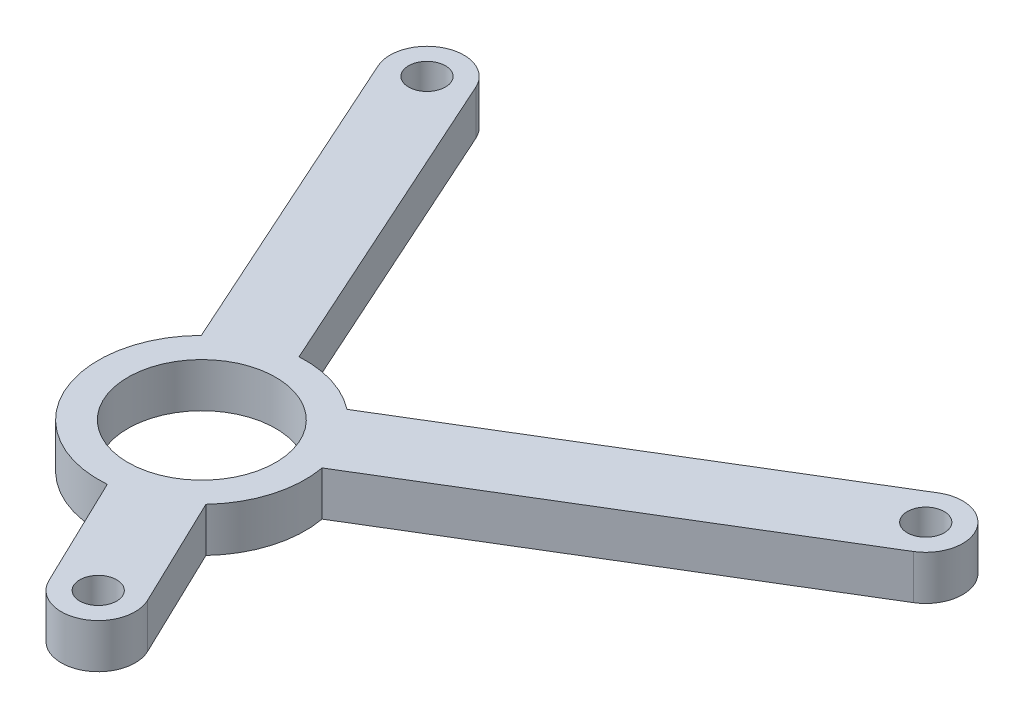
ISO-10303-21;
HEADER;
FILE_DESCRIPTION(('STEP AP214'),'2;1');
FILE_NAME('part.step','',(''),(''),'','','');
FILE_SCHEMA(('AUTOMOTIVE_DESIGN { 1 0 10303 214 1 1 1 1 }'));
ENDSEC;
DATA;
#1=APPLICATION_CONTEXT('core data for automotive mechanical design processes');
#2=APPLICATION_PROTOCOL_DEFINITION('international standard','automotive_design',2000,#1);
#3=PRODUCT_CONTEXT('',#1,'mechanical');
#4=PRODUCT('Part','Part','',(#3));
#5=PRODUCT_RELATED_PRODUCT_CATEGORY('part','',(#4));
#6=PRODUCT_DEFINITION_FORMATION('','',#4);
#7=PRODUCT_DEFINITION_CONTEXT('part definition',#1,'design');
#8=PRODUCT_DEFINITION('design','',#6,#7);
#9=PRODUCT_DEFINITION_SHAPE('','',#8);
#10=(LENGTH_UNIT() NAMED_UNIT(*) SI_UNIT(.MILLI.,.METRE.));
#11=(NAMED_UNIT(*) PLANE_ANGLE_UNIT() SI_UNIT($,.RADIAN.));
#12=(NAMED_UNIT(*) SI_UNIT($,.STERADIAN.) SOLID_ANGLE_UNIT());
#13=UNCERTAINTY_MEASURE_WITH_UNIT(LENGTH_MEASURE(1.E-05),#10,'distance_accuracy_value','');
#14=(GEOMETRIC_REPRESENTATION_CONTEXT(3) GLOBAL_UNCERTAINTY_ASSIGNED_CONTEXT((#13)) GLOBAL_UNIT_ASSIGNED_CONTEXT((#10,
#11,#12)) REPRESENTATION_CONTEXT('',''));
#15=CARTESIAN_POINT('',(0.,0.,0.));
#16=DIRECTION('',(0.,0.,1.));
#17=DIRECTION('',(1.,0.,0.));
#18=AXIS2_PLACEMENT_3D('',#15,#16,#17);
#19=CARTESIAN_POINT('',(0.,3.,0.));
#20=DIRECTION('',(0.,1.,0.));
#21=DIRECTION('',(0.,0.,1.));
#22=AXIS2_PLACEMENT_3D('',#19,#20,#21);
#23=PLANE('',#22);
#24=CARTESIAN_POINT('',(-6.49000000000011,3.,11.5));
#25=DIRECTION('',(0.,1.,0.));
#26=DIRECTION('',(0.,0.,1.));
#27=AXIS2_PLACEMENT_3D('',#24,#25,#26);
#28=CIRCLE('',#27,5.00000000000009);
#29=CARTESIAN_POINT('',(-6.49000000000011,3.,16.5));
#30=VERTEX_POINT('',#29);
#31=EDGE_CURVE('E392',#30,#30,#28,.T.);
#32=ORIENTED_EDGE('',*,*,#31,.F.);
#33=EDGE_LOOP('',(#32));
#34=FACE_BOUND('',#33,.T.);
#35=CARTESIAN_POINT('',(24.,3.,-7.));
#36=DIRECTION('',(0.,1.,0.));
#37=DIRECTION('',(0.,0.,1.));
#38=AXIS2_PLACEMENT_3D('',#35,#36,#37);
#39=CIRCLE('',#38,1.25);
#40=CARTESIAN_POINT('',(24.,3.,-5.75));
#41=VERTEX_POINT('',#40);
#42=EDGE_CURVE('E487',#41,#41,#39,.T.);
#43=ORIENTED_EDGE('',*,*,#42,.F.);
#44=EDGE_LOOP('',(#43));
#45=FACE_BOUND('',#44,.T.);
#46=CARTESIAN_POINT('',(-19.,3.,-16.2480768092719));
#47=DIRECTION('',(0.,1.,0.));
#48=DIRECTION('',(0.,0.,1.));
#49=AXIS2_PLACEMENT_3D('',#46,#47,#48);
#50=CIRCLE('',#49,1.25);
#51=CARTESIAN_POINT('',(-19.,3.,-14.9980768092719));
#52=VERTEX_POINT('',#51);
#53=EDGE_CURVE('E479',#52,#52,#50,.T.);
#54=ORIENTED_EDGE('',*,*,#53,.F.);
#55=EDGE_LOOP('',(#54));
#56=FACE_BOUND('',#55,.T.);
#57=CARTESIAN_POINT('',(0.,3.,25.));
#58=DIRECTION('',(0.,1.,0.));
#59=DIRECTION('',(0.,0.,1.));
#60=AXIS2_PLACEMENT_3D('',#57,#58,#59);
#61=CIRCLE('',#60,1.25);
#62=CARTESIAN_POINT('',(0.,3.,26.25));
#63=VERTEX_POINT('',#62);
#64=EDGE_CURVE('E292',#63,#63,#61,.T.);
#65=ORIENTED_EDGE('',*,*,#64,.F.);
#66=EDGE_LOOP('',(#65));
#67=FACE_BOUND('',#66,.T.);
#68=DIRECTION('',(-0.433273578462035,0.,-0.901262451346278));
#69=VECTOR('',#68,1.);
#70=CARTESIAN_POINT('',(-12.0154863140724,3.,5.77633379098752));
#71=LINE('',#70,#69);
#72=CARTESIAN_POINT('',(-2.2531561283657,3.,26.0831839461551));
#73=VERTEX_POINT('',#72);
#74=CARTESIAN_POINT('',(-5.91026251323244,3.,18.4759518666944));
#75=VERTEX_POINT('',#74);
#76=EDGE_CURVE('E414',#73,#75,#71,.T.);
#77=ORIENTED_EDGE('',*,*,#76,.F.);
#78=CARTESIAN_POINT('',(0.,3.,25.));
#79=DIRECTION('',(0.,1.,0.));
#80=DIRECTION('',(0.,0.,1.));
#81=AXIS2_PLACEMENT_3D('',#78,#79,#80);
#82=CIRCLE('',#81,2.5);
#83=CARTESIAN_POINT('',(2.2531561283657,3.,23.9168160538449));
#84=VERTEX_POINT('',#83);
#85=EDGE_CURVE('E417',#73,#84,#82,.T.);
#86=ORIENTED_EDGE('',*,*,#85,.T.);
#87=DIRECTION('',(-0.433273578462035,0.,-0.901262451346278));
#88=VECTOR('',#87,1.);
#89=CARTESIAN_POINT('',(-7.50917405734101,3.,3.60996589867735));
#90=LINE('',#89,#88);
#91=CARTESIAN_POINT('',(-1.40395025650104,3.,16.3095839743842));
#92=VERTEX_POINT('',#91);
#93=EDGE_CURVE('E439',#84,#92,#90,.T.);
#94=ORIENTED_EDGE('',*,*,#93,.T.);
#95=CARTESIAN_POINT('',(-6.49000000000011,3.,11.5));
#96=DIRECTION('',(0.,1.,0.));
#97=DIRECTION('',(0.,0.,1.));
#98=AXIS2_PLACEMENT_3D('',#95,#96,#97);
#99=CIRCLE('',#98,7.00000000000009);
#100=CARTESIAN_POINT('',(0.396698534826501,3.,10.2456542380914));
#101=VERTEX_POINT('',#100);
#102=EDGE_CURVE('E435',#92,#101,#99,.T.);
#103=ORIENTED_EDGE('',*,*,#102,.T.);
#104=DIRECTION('',(-0.854934082594623,0.,0.51873665227945));
#105=VECTOR('',#104,1.);
#106=CARTESIAN_POINT('',(4.65054726925964,3.,7.66460466160688));
#107=LINE('',#106,#105);
#108=CARTESIAN_POINT('',(25.2968416306986,3.,-4.86266479351345));
#109=VERTEX_POINT('',#108);
#110=EDGE_CURVE('E444',#109,#101,#107,.T.);
#111=ORIENTED_EDGE('',*,*,#110,.F.);
#112=CARTESIAN_POINT('',(24.,3.,-7.));
#113=DIRECTION('',(0.,1.,0.));
#114=DIRECTION('',(0.,0.,1.));
#115=AXIS2_PLACEMENT_3D('',#112,#113,#114);
#116=CIRCLE('',#115,2.49999999999999);
#117=CARTESIAN_POINT('',(22.7031583693014,3.,-9.13733520648656));
#118=VERTEX_POINT('',#117);
#119=EDGE_CURVE('E462',#109,#118,#116,.T.);
#120=ORIENTED_EDGE('',*,*,#119,.T.);
#121=DIRECTION('',(-0.854934082594623,0.,0.51873665227945));
#122=VECTOR('',#121,1.);
#123=CARTESIAN_POINT('',(2.0568640078624,3.,3.38993424863378));
#124=LINE('',#123,#122);
#125=CARTESIAN_POINT('',(-2.19698472657074,3.,5.97098382511828));
#126=VERTEX_POINT('',#125);
#127=EDGE_CURVE('E473',#118,#126,#124,.T.);
#128=ORIENTED_EDGE('',*,*,#127,.T.);
#129=CARTESIAN_POINT('',(-6.49000000000011,3.,11.5));
#130=DIRECTION('',(0.,1.,0.));
#131=DIRECTION('',(0.,0.,1.));
#132=AXIS2_PLACEMENT_3D('',#129,#130,#131);
#133=CIRCLE('',#132,7.00000000000009);
#134=CARTESIAN_POINT('',(-6.89819547233546,3.,4.51191181678674));
#135=VERTEX_POINT('',#134);
#136=EDGE_CURVE('E471',#126,#135,#133,.T.);
#137=ORIENTED_EDGE('',*,*,#136,.T.);
#138=DIRECTION('',(-0.411002952606421,0.,-0.911634012610765));
#139=VECTOR('',#138,1.);
#140=CARTESIAN_POINT('',(-7.42347104202468,3.,3.34681294758043));
#141=LINE('',#140,#139);
#142=CARTESIAN_POINT('',(-16.720914968473,3.,-17.275584190788));
#143=VERTEX_POINT('',#142);
#144=EDGE_CURVE('E390',#135,#143,#141,.T.);
#145=ORIENTED_EDGE('',*,*,#144,.T.);
#146=CARTESIAN_POINT('',(-19.,3.,-16.2480768092719));
#147=DIRECTION('',(0.,1.,0.));
#148=DIRECTION('',(0.,0.,1.));
#149=AXIS2_PLACEMENT_3D('',#146,#147,#148);
#150=CIRCLE('',#149,2.5);
#151=CARTESIAN_POINT('',(-21.279085031527,3.,-15.2205694277558));
#152=VERTEX_POINT('',#151);
#153=EDGE_CURVE('E383',#143,#152,#150,.T.);
#154=ORIENTED_EDGE('',*,*,#153,.T.);
#155=DIRECTION('',(0.411002952606429,0.,0.911634012610761));
#156=VECTOR('',#155,1.);
#157=CARTESIAN_POINT('',(-11.9816411050785,3.,5.40182771061266));
#158=LINE('',#157,#156);
#159=CARTESIAN_POINT('',(-11.4563655353894,3.,6.56692657981878));
#160=VERTEX_POINT('',#159);
#161=EDGE_CURVE('E388',#152,#160,#158,.T.);
#162=ORIENTED_EDGE('',*,*,#161,.T.);
#163=CARTESIAN_POINT('',(-6.49000000000011,3.,11.5));
#164=DIRECTION('',(0.,1.,0.));
#165=DIRECTION('',(0.,0.,1.));
#166=AXIS2_PLACEMENT_3D('',#163,#164,#165);
#167=CIRCLE('',#166,7.00000000000009);
#168=EDGE_CURVE('E401',#160,#75,#167,.T.);
#169=ORIENTED_EDGE('',*,*,#168,.T.);
#170=EDGE_LOOP('',(#77,#86,#94,#103,#111,#120,#128,#137,#145,#154,#162,#169));
#171=FACE_BOUND('',#170,.T.);
#172=ADVANCED_FACE('F288',(#34,#45,#56,#67,#171),#23,.T.);
#173=CARTESIAN_POINT('',(0.,0.,0.));
#174=DIRECTION('',(0.,1.,0.));
#175=DIRECTION('',(0.,0.,1.));
#176=AXIS2_PLACEMENT_3D('',#173,#174,#175);
#177=PLANE('',#176);
#178=CARTESIAN_POINT('',(-6.49000000000011,0.,11.5));
#179=DIRECTION('',(0.,1.,0.));
#180=DIRECTION('',(0.,0.,1.));
#181=AXIS2_PLACEMENT_3D('',#178,#179,#180);
#182=CIRCLE('',#181,5.00000000000009);
#183=CARTESIAN_POINT('',(-6.49000000000011,0.,16.5));
#184=VERTEX_POINT('',#183);
#185=EDGE_CURVE('E447',#184,#184,#182,.T.);
#186=ORIENTED_EDGE('',*,*,#185,.T.);
#187=EDGE_LOOP('',(#186));
#188=FACE_BOUND('',#187,.T.);
#189=CARTESIAN_POINT('',(0.,0.,25.));
#190=DIRECTION('',(0.,1.,0.));
#191=DIRECTION('',(0.,0.,1.));
#192=AXIS2_PLACEMENT_3D('',#189,#190,#191);
#193=CIRCLE('',#192,1.25);
#194=CARTESIAN_POINT('',(0.,0.,26.25));
#195=VERTEX_POINT('',#194);
#196=EDGE_CURVE('E12',#195,#195,#193,.T.);
#197=ORIENTED_EDGE('',*,*,#196,.T.);
#198=EDGE_LOOP('',(#197));
#199=FACE_BOUND('',#198,.T.);
#200=CARTESIAN_POINT('',(-19.,0.,-16.2480768092719));
#201=DIRECTION('',(0.,1.,0.));
#202=DIRECTION('',(0.,0.,1.));
#203=AXIS2_PLACEMENT_3D('',#200,#201,#202);
#204=CIRCLE('',#203,1.25);
#205=CARTESIAN_POINT('',(-19.,0.,-14.9980768092719));
#206=VERTEX_POINT('',#205);
#207=EDGE_CURVE('E490',#206,#206,#204,.T.);
#208=ORIENTED_EDGE('',*,*,#207,.T.);
#209=EDGE_LOOP('',(#208));
#210=FACE_BOUND('',#209,.T.);
#211=CARTESIAN_POINT('',(24.,0.,-7.));
#212=DIRECTION('',(0.,1.,0.));
#213=DIRECTION('',(0.,0.,1.));
#214=AXIS2_PLACEMENT_3D('',#211,#212,#213);
#215=CIRCLE('',#214,1.25);
#216=CARTESIAN_POINT('',(24.,0.,-5.75));
#217=VERTEX_POINT('',#216);
#218=EDGE_CURVE('E484',#217,#217,#215,.T.);
#219=ORIENTED_EDGE('',*,*,#218,.T.);
#220=EDGE_LOOP('',(#219));
#221=FACE_BOUND('',#220,.T.);
#222=CARTESIAN_POINT('',(0.,0.,25.));
#223=DIRECTION('',(0.,1.,0.));
#224=DIRECTION('',(0.,0.,1.));
#225=AXIS2_PLACEMENT_3D('',#222,#223,#224);
#226=CIRCLE('',#225,2.5);
#227=CARTESIAN_POINT('',(-2.2531561283657,0.,26.0831839461551));
#228=VERTEX_POINT('',#227);
#229=CARTESIAN_POINT('',(2.2531561283657,0.,23.9168160538449));
#230=VERTEX_POINT('',#229);
#231=EDGE_CURVE('E429',#228,#230,#226,.T.);
#232=ORIENTED_EDGE('',*,*,#231,.F.);
#233=DIRECTION('',(-0.433273578462035,0.,-0.901262451346278));
#234=VECTOR('',#233,1.);
#235=CARTESIAN_POINT('',(-12.0154863140724,0.,5.77633379098752));
#236=LINE('',#235,#234);
#237=CARTESIAN_POINT('',(-5.91026251323244,0.,18.4759518666944));
#238=VERTEX_POINT('',#237);
#239=EDGE_CURVE('E423',#228,#238,#236,.T.);
#240=ORIENTED_EDGE('',*,*,#239,.T.);
#241=CARTESIAN_POINT('',(-6.49000000000011,0.,11.5));
#242=DIRECTION('',(0.,1.,0.));
#243=DIRECTION('',(0.,0.,1.));
#244=AXIS2_PLACEMENT_3D('',#241,#242,#243);
#245=CIRCLE('',#244,7.00000000000009);
#246=CARTESIAN_POINT('',(-11.4563655353894,0.,6.56692657981878));
#247=VERTEX_POINT('',#246);
#248=EDGE_CURVE('E418',#247,#238,#245,.T.);
#249=ORIENTED_EDGE('',*,*,#248,.F.);
#250=DIRECTION('',(0.411002952606429,0.,0.911634012610761));
#251=VECTOR('',#250,1.);
#252=CARTESIAN_POINT('',(-11.9816411050785,0.,5.40182771061266));
#253=LINE('',#252,#251);
#254=CARTESIAN_POINT('',(-21.279085031527,0.,-15.2205694277558));
#255=VERTEX_POINT('',#254);
#256=EDGE_CURVE('E419',#255,#247,#253,.T.);
#257=ORIENTED_EDGE('',*,*,#256,.F.);
#258=CARTESIAN_POINT('',(-19.,0.,-16.2480768092719));
#259=DIRECTION('',(0.,1.,0.));
#260=DIRECTION('',(0.,0.,1.));
#261=AXIS2_PLACEMENT_3D('',#258,#259,#260);
#262=CIRCLE('',#261,2.5);
#263=CARTESIAN_POINT('',(-16.720914968473,0.,-17.275584190788));
#264=VERTEX_POINT('',#263);
#265=EDGE_CURVE('E398',#264,#255,#262,.T.);
#266=ORIENTED_EDGE('',*,*,#265,.F.);
#267=DIRECTION('',(-0.411002952606421,0.,-0.911634012610765));
#268=VECTOR('',#267,1.);
#269=CARTESIAN_POINT('',(-7.42347104202468,0.,3.34681294758043));
#270=LINE('',#269,#268);
#271=CARTESIAN_POINT('',(-6.89819547233546,0.,4.51191181678674));
#272=VERTEX_POINT('',#271);
#273=EDGE_CURVE('E332',#272,#264,#270,.T.);
#274=ORIENTED_EDGE('',*,*,#273,.F.);
#275=CARTESIAN_POINT('',(-6.49000000000011,0.,11.5));
#276=DIRECTION('',(0.,1.,0.));
#277=DIRECTION('',(0.,0.,1.));
#278=AXIS2_PLACEMENT_3D('',#275,#276,#277);
#279=CIRCLE('',#278,7.00000000000009);
#280=CARTESIAN_POINT('',(-2.19698472657074,0.,5.97098382511828));
#281=VERTEX_POINT('',#280);
#282=EDGE_CURVE('E464',#281,#272,#279,.T.);
#283=ORIENTED_EDGE('',*,*,#282,.F.);
#284=DIRECTION('',(-0.854934082594623,0.,0.51873665227945));
#285=VECTOR('',#284,1.);
#286=CARTESIAN_POINT('',(2.0568640078624,0.,3.38993424863378));
#287=LINE('',#286,#285);
#288=CARTESIAN_POINT('',(22.7031583693014,0.,-9.13733520648656));
#289=VERTEX_POINT('',#288);
#290=EDGE_CURVE('E466',#289,#281,#287,.T.);
#291=ORIENTED_EDGE('',*,*,#290,.F.);
#292=CARTESIAN_POINT('',(24.,0.,-7.));
#293=DIRECTION('',(0.,1.,0.));
#294=DIRECTION('',(0.,0.,1.));
#295=AXIS2_PLACEMENT_3D('',#292,#293,#294);
#296=CIRCLE('',#295,2.49999999999999);
#297=CARTESIAN_POINT('',(25.2968416306986,0.,-4.86266479351345));
#298=VERTEX_POINT('',#297);
#299=EDGE_CURVE('E312',#298,#289,#296,.T.);
#300=ORIENTED_EDGE('',*,*,#299,.F.);
#301=DIRECTION('',(-0.854934082594623,0.,0.51873665227945));
#302=VECTOR('',#301,1.);
#303=CARTESIAN_POINT('',(4.65054726925964,0.,7.66460466160688));
#304=LINE('',#303,#302);
#305=CARTESIAN_POINT('',(0.396698534826501,0.,10.2456542380914));
#306=VERTEX_POINT('',#305);
#307=EDGE_CURVE('E432',#298,#306,#304,.T.);
#308=ORIENTED_EDGE('',*,*,#307,.T.);
#309=CARTESIAN_POINT('',(-6.49000000000011,0.,11.5));
#310=DIRECTION('',(0.,1.,0.));
#311=DIRECTION('',(0.,0.,1.));
#312=AXIS2_PLACEMENT_3D('',#309,#310,#311);
#313=CIRCLE('',#312,7.00000000000009);
#314=CARTESIAN_POINT('',(-1.40395025650104,0.,16.3095839743842));
#315=VERTEX_POINT('',#314);
#316=EDGE_CURVE('E448',#315,#306,#313,.T.);
#317=ORIENTED_EDGE('',*,*,#316,.F.);
#318=DIRECTION('',(-0.433273578462035,0.,-0.901262451346278));
#319=VECTOR('',#318,1.);
#320=CARTESIAN_POINT('',(-7.50917405734101,0.,3.60996589867735));
#321=LINE('',#320,#319);
#322=EDGE_CURVE('E451',#230,#315,#321,.T.);
#323=ORIENTED_EDGE('',*,*,#322,.F.);
#324=EDGE_LOOP('',(#232,#240,#249,#257,#266,#274,#283,#291,#300,#308,#317,#323));
#325=FACE_BOUND('',#324,.T.);
#326=ADVANCED_FACE('F290',(#188,#199,#210,#221,#325),#177,.F.);
#327=CARTESIAN_POINT('',(0.,0.,25.));
#328=DIRECTION('',(0.,1.,0.));
#329=DIRECTION('',(0.,0.,1.));
#330=AXIS2_PLACEMENT_3D('',#327,#328,#329);
#331=CYLINDRICAL_SURFACE('',#330,1.25);
#332=ORIENTED_EDGE('',*,*,#196,.F.);
#333=EDGE_LOOP('',(#332));
#334=FACE_BOUND('',#333,.T.);
#335=ORIENTED_EDGE('',*,*,#64,.T.);
#336=EDGE_LOOP('',(#335));
#337=FACE_BOUND('',#336,.T.);
#338=ADVANCED_FACE('F504',(#334,#337),#331,.F.);
#339=CARTESIAN_POINT('',(-19.,0.,-16.2480768092719));
#340=DIRECTION('',(0.,1.,0.));
#341=DIRECTION('',(0.,0.,1.));
#342=AXIS2_PLACEMENT_3D('',#339,#340,#341);
#343=CYLINDRICAL_SURFACE('',#342,1.25);
#344=ORIENTED_EDGE('',*,*,#207,.F.);
#345=EDGE_LOOP('',(#344));
#346=FACE_BOUND('',#345,.T.);
#347=ORIENTED_EDGE('',*,*,#53,.T.);
#348=EDGE_LOOP('',(#347));
#349=FACE_BOUND('',#348,.T.);
#350=ADVANCED_FACE('F496',(#346,#349),#343,.F.);
#351=CARTESIAN_POINT('',(24.,0.,-7.));
#352=DIRECTION('',(0.,1.,0.));
#353=DIRECTION('',(0.,0.,1.));
#354=AXIS2_PLACEMENT_3D('',#351,#352,#353);
#355=CYLINDRICAL_SURFACE('',#354,1.25);
#356=ORIENTED_EDGE('',*,*,#218,.F.);
#357=EDGE_LOOP('',(#356));
#358=FACE_BOUND('',#357,.T.);
#359=ORIENTED_EDGE('',*,*,#42,.T.);
#360=EDGE_LOOP('',(#359));
#361=FACE_BOUND('',#360,.T.);
#362=ADVANCED_FACE('F512',(#358,#361),#355,.F.);
#363=CARTESIAN_POINT('',(-19.,0.,-16.2480768092719));
#364=DIRECTION('',(0.,1.,0.));
#365=DIRECTION('',(0.,0.,1.));
#366=AXIS2_PLACEMENT_3D('',#363,#364,#365);
#367=CYLINDRICAL_SURFACE('',#366,2.5);
#368=ORIENTED_EDGE('',*,*,#153,.F.);
#369=DIRECTION('',(0.,1.,0.));
#370=VECTOR('',#369,1.);
#371=CARTESIAN_POINT('',(-16.720914968473,0.,-17.275584190788));
#372=LINE('',#371,#370);
#373=EDGE_CURVE('E468',#264,#143,#372,.T.);
#374=ORIENTED_EDGE('',*,*,#373,.F.);
#375=ORIENTED_EDGE('',*,*,#265,.T.);
#376=DIRECTION('',(0.,1.,0.));
#377=VECTOR('',#376,1.);
#378=CARTESIAN_POINT('',(-21.279085031527,0.,-15.2205694277558));
#379=LINE('',#378,#377);
#380=EDGE_CURVE('E395',#255,#152,#379,.T.);
#381=ORIENTED_EDGE('',*,*,#380,.T.);
#382=EDGE_LOOP('',(#368,#374,#375,#381));
#383=FACE_BOUND('',#382,.T.);
#384=ADVANCED_FACE('F396',(#383),#367,.T.);
#385=CARTESIAN_POINT('',(24.,0.,-7.));
#386=DIRECTION('',(0.,1.,0.));
#387=DIRECTION('',(0.,0.,1.));
#388=AXIS2_PLACEMENT_3D('',#385,#386,#387);
#389=CYLINDRICAL_SURFACE('',#388,2.49999999999999);
#390=ORIENTED_EDGE('',*,*,#119,.F.);
#391=DIRECTION('',(0.,1.,0.));
#392=VECTOR('',#391,1.);
#393=CARTESIAN_POINT('',(25.2968416306986,0.,-4.86266479351345));
#394=LINE('',#393,#392);
#395=EDGE_CURVE('E426',#298,#109,#394,.T.);
#396=ORIENTED_EDGE('',*,*,#395,.F.);
#397=ORIENTED_EDGE('',*,*,#299,.T.);
#398=DIRECTION('',(0.,1.,0.));
#399=VECTOR('',#398,1.);
#400=CARTESIAN_POINT('',(22.7031583693014,0.,-9.13733520648656));
#401=LINE('',#400,#399);
#402=EDGE_CURVE('E329',#289,#118,#401,.T.);
#403=ORIENTED_EDGE('',*,*,#402,.T.);
#404=EDGE_LOOP('',(#390,#396,#397,#403));
#405=FACE_BOUND('',#404,.T.);
#406=ADVANCED_FACE('F523',(#405),#389,.T.);
#407=CARTESIAN_POINT('',(2.0568640078624,0.,3.38993424863378));
#408=DIRECTION('',(-0.51873665227945,0.,-0.854934082594623));
#409=DIRECTION('',(-0.854934082594623,0.,0.51873665227945));
#410=AXIS2_PLACEMENT_3D('',#407,#408,#409);
#411=PLANE('',#410);
#412=ORIENTED_EDGE('',*,*,#127,.F.);
#413=ORIENTED_EDGE('',*,*,#402,.F.);
#414=ORIENTED_EDGE('',*,*,#290,.T.);
#415=DIRECTION('',(0.,1.,0.));
#416=VECTOR('',#415,1.);
#417=CARTESIAN_POINT('',(-2.19698472657074,0.,5.97098382511828));
#418=LINE('',#417,#416);
#419=EDGE_CURVE('E480',#281,#126,#418,.T.);
#420=ORIENTED_EDGE('',*,*,#419,.T.);
#421=EDGE_LOOP('',(#412,#413,#414,#420));
#422=FACE_BOUND('',#421,.T.);
#423=ADVANCED_FACE('F531',(#422),#411,.T.);
#424=CARTESIAN_POINT('',(-6.49000000000011,0.,11.5));
#425=DIRECTION('',(0.,1.,0.));
#426=DIRECTION('',(0.,0.,1.));
#427=AXIS2_PLACEMENT_3D('',#424,#425,#426);
#428=CYLINDRICAL_SURFACE('',#427,7.00000000000009);
#429=ORIENTED_EDGE('',*,*,#136,.F.);
#430=ORIENTED_EDGE('',*,*,#419,.F.);
#431=ORIENTED_EDGE('',*,*,#282,.T.);
#432=DIRECTION('',(0.,1.,0.));
#433=VECTOR('',#432,1.);
#434=CARTESIAN_POINT('',(-6.89819547233546,0.,4.51191181678674));
#435=LINE('',#434,#433);
#436=EDGE_CURVE('E303',#272,#135,#435,.T.);
#437=ORIENTED_EDGE('',*,*,#436,.T.);
#438=EDGE_LOOP('',(#429,#430,#431,#437));
#439=FACE_BOUND('',#438,.T.);
#440=ADVANCED_FACE('F528',(#439),#428,.T.);
#441=CARTESIAN_POINT('',(-7.42347104202468,0.,3.34681294758043));
#442=DIRECTION('',(0.911634012610765,0.,-0.411002952606421));
#443=DIRECTION('',(-0.411002952606421,0.,-0.911634012610765));
#444=AXIS2_PLACEMENT_3D('',#441,#442,#443);
#445=PLANE('',#444);
#446=ORIENTED_EDGE('',*,*,#144,.F.);
#447=ORIENTED_EDGE('',*,*,#436,.F.);
#448=ORIENTED_EDGE('',*,*,#273,.T.);
#449=ORIENTED_EDGE('',*,*,#373,.T.);
#450=EDGE_LOOP('',(#446,#447,#448,#449));
#451=FACE_BOUND('',#450,.T.);
#452=ADVANCED_FACE('F524',(#451),#445,.T.);
#453=CARTESIAN_POINT('',(-6.49000000000011,0.,11.5));
#454=DIRECTION('',(0.,1.,0.));
#455=DIRECTION('',(0.,0.,1.));
#456=AXIS2_PLACEMENT_3D('',#453,#454,#455);
#457=CYLINDRICAL_SURFACE('',#456,5.00000000000009);
#458=ORIENTED_EDGE('',*,*,#185,.F.);
#459=EDGE_LOOP('',(#458));
#460=FACE_BOUND('',#459,.T.);
#461=ORIENTED_EDGE('',*,*,#31,.T.);
#462=EDGE_LOOP('',(#461));
#463=FACE_BOUND('',#462,.T.);
#464=ADVANCED_FACE('F527',(#460,#463),#457,.F.);
#465=CARTESIAN_POINT('',(0.,0.,25.));
#466=DIRECTION('',(0.,1.,0.));
#467=DIRECTION('',(0.,0.,1.));
#468=AXIS2_PLACEMENT_3D('',#465,#466,#467);
#469=CYLINDRICAL_SURFACE('',#468,2.5);
#470=ORIENTED_EDGE('',*,*,#85,.F.);
#471=DIRECTION('',(0.,1.,0.));
#472=VECTOR('',#471,1.);
#473=CARTESIAN_POINT('',(-2.2531561283657,0.,26.0831839461551));
#474=LINE('',#473,#472);
#475=EDGE_CURVE('E407',#228,#73,#474,.T.);
#476=ORIENTED_EDGE('',*,*,#475,.F.);
#477=ORIENTED_EDGE('',*,*,#231,.T.);
#478=DIRECTION('',(0.,1.,0.));
#479=VECTOR('',#478,1.);
#480=CARTESIAN_POINT('',(2.2531561283657,0.,23.9168160538449));
#481=LINE('',#480,#479);
#482=EDGE_CURVE('E436',#230,#84,#481,.T.);
#483=ORIENTED_EDGE('',*,*,#482,.T.);
#484=EDGE_LOOP('',(#470,#476,#477,#483));
#485=FACE_BOUND('',#484,.T.);
#486=ADVANCED_FACE('F540',(#485),#469,.T.);
#487=CARTESIAN_POINT('',(-7.50917405734101,0.,3.60996589867735));
#488=DIRECTION('',(0.901262451346278,0.,-0.433273578462035));
#489=DIRECTION('',(-0.433273578462035,0.,-0.901262451346278));
#490=AXIS2_PLACEMENT_3D('',#487,#488,#489);
#491=PLANE('',#490);
#492=ORIENTED_EDGE('',*,*,#93,.F.);
#493=ORIENTED_EDGE('',*,*,#482,.F.);
#494=ORIENTED_EDGE('',*,*,#322,.T.);
#495=DIRECTION('',(0.,1.,0.));
#496=VECTOR('',#495,1.);
#497=CARTESIAN_POINT('',(-1.40395025650104,0.,16.3095839743842));
#498=LINE('',#497,#496);
#499=EDGE_CURVE('E433',#315,#92,#498,.T.);
#500=ORIENTED_EDGE('',*,*,#499,.T.);
#501=EDGE_LOOP('',(#492,#493,#494,#500));
#502=FACE_BOUND('',#501,.T.);
#503=ADVANCED_FACE('F542',(#502),#491,.T.);
#504=CARTESIAN_POINT('',(-6.49000000000011,0.,11.5));
#505=DIRECTION('',(0.,1.,0.));
#506=DIRECTION('',(0.,0.,1.));
#507=AXIS2_PLACEMENT_3D('',#504,#505,#506);
#508=CYLINDRICAL_SURFACE('',#507,7.00000000000009);
#509=ORIENTED_EDGE('',*,*,#102,.F.);
#510=ORIENTED_EDGE('',*,*,#499,.F.);
#511=ORIENTED_EDGE('',*,*,#316,.T.);
#512=DIRECTION('',(0.,1.,0.));
#513=VECTOR('',#512,1.);
#514=CARTESIAN_POINT('',(0.396698534826501,0.,10.2456542380914));
#515=LINE('',#514,#513);
#516=EDGE_CURVE('E430',#306,#101,#515,.T.);
#517=ORIENTED_EDGE('',*,*,#516,.T.);
#518=EDGE_LOOP('',(#509,#510,#511,#517));
#519=FACE_BOUND('',#518,.T.);
#520=ADVANCED_FACE('F545',(#519),#508,.T.);
#521=CARTESIAN_POINT('',(4.65054726925964,0.,7.66460466160688));
#522=DIRECTION('',(-0.51873665227945,0.,-0.854934082594623));
#523=DIRECTION('',(-0.854934082594623,0.,0.51873665227945));
#524=AXIS2_PLACEMENT_3D('',#521,#522,#523);
#525=PLANE('',#524);
#526=ORIENTED_EDGE('',*,*,#110,.T.);
#527=ORIENTED_EDGE('',*,*,#516,.F.);
#528=ORIENTED_EDGE('',*,*,#307,.F.);
#529=ORIENTED_EDGE('',*,*,#395,.T.);
#530=EDGE_LOOP('',(#526,#527,#528,#529));
#531=FACE_BOUND('',#530,.T.);
#532=ADVANCED_FACE('F549',(#531),#525,.F.);
#533=CARTESIAN_POINT('',(-11.9816411050785,0.,5.40182771061266));
#534=DIRECTION('',(-0.911634012610761,0.,0.411002952606429));
#535=DIRECTION('',(0.411002952606429,0.,0.911634012610761));
#536=AXIS2_PLACEMENT_3D('',#533,#534,#535);
#537=PLANE('',#536);
#538=ORIENTED_EDGE('',*,*,#161,.F.);
#539=ORIENTED_EDGE('',*,*,#380,.F.);
#540=ORIENTED_EDGE('',*,*,#256,.T.);
#541=DIRECTION('',(0.,1.,0.));
#542=VECTOR('',#541,1.);
#543=CARTESIAN_POINT('',(-11.4563655353894,0.,6.56692657981878));
#544=LINE('',#543,#542);
#545=EDGE_CURVE('E405',#247,#160,#544,.T.);
#546=ORIENTED_EDGE('',*,*,#545,.T.);
#547=EDGE_LOOP('',(#538,#539,#540,#546));
#548=FACE_BOUND('',#547,.T.);
#549=ADVANCED_FACE('F403',(#548),#537,.T.);
#550=CARTESIAN_POINT('',(-6.49000000000011,0.,11.5));
#551=DIRECTION('',(0.,1.,0.));
#552=DIRECTION('',(0.,0.,1.));
#553=AXIS2_PLACEMENT_3D('',#550,#551,#552);
#554=CYLINDRICAL_SURFACE('',#553,7.00000000000009);
#555=ORIENTED_EDGE('',*,*,#168,.F.);
#556=ORIENTED_EDGE('',*,*,#545,.F.);
#557=ORIENTED_EDGE('',*,*,#248,.T.);
#558=DIRECTION('',(0.,1.,0.));
#559=VECTOR('',#558,1.);
#560=CARTESIAN_POINT('',(-5.91026251323244,0.,18.4759518666944));
#561=LINE('',#560,#559);
#562=EDGE_CURVE('E421',#238,#75,#561,.T.);
#563=ORIENTED_EDGE('',*,*,#562,.T.);
#564=EDGE_LOOP('',(#555,#556,#557,#563));
#565=FACE_BOUND('',#564,.T.);
#566=ADVANCED_FACE('F559',(#565),#554,.T.);
#567=CARTESIAN_POINT('',(-12.0154863140724,0.,5.77633379098752));
#568=DIRECTION('',(0.901262451346278,0.,-0.433273578462035));
#569=DIRECTION('',(-0.433273578462035,0.,-0.901262451346278));
#570=AXIS2_PLACEMENT_3D('',#567,#568,#569);
#571=PLANE('',#570);
#572=ORIENTED_EDGE('',*,*,#76,.T.);
#573=ORIENTED_EDGE('',*,*,#562,.F.);
#574=ORIENTED_EDGE('',*,*,#239,.F.);
#575=ORIENTED_EDGE('',*,*,#475,.T.);
#576=EDGE_LOOP('',(#572,#573,#574,#575));
#577=FACE_BOUND('',#576,.T.);
#578=ADVANCED_FACE('F562',(#577),#571,.F.);
#579=CLOSED_SHELL('',(#172,#326,#338,#350,#362,#384,#406,#423,#440,#452,#464,#486,#503,#520,
#532,#549,#566,#578));
#580=MANIFOLD_SOLID_BREP('B2',#579);
#581=ADVANCED_BREP_SHAPE_REPRESENTATION('',(#18,#580),#14);
#582=SHAPE_DEFINITION_REPRESENTATION(#9,#581);
ENDSEC;
END-ISO-10303-21;
